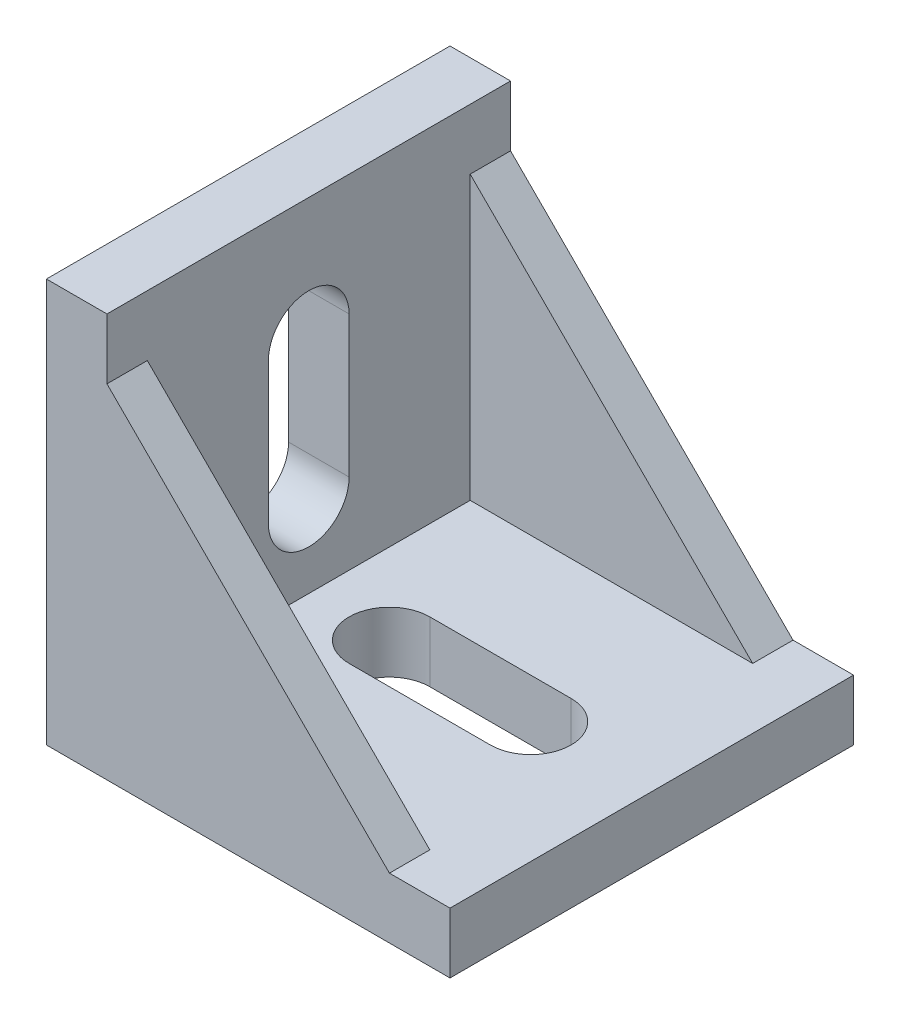
ISO-10303-21;
HEADER;
FILE_DESCRIPTION(('STEP AP214'),'2;1');
FILE_NAME('part.step','',(''),(''),'','','');
FILE_SCHEMA(('AUTOMOTIVE_DESIGN { 1 0 10303 214 1 1 1 1 }'));
ENDSEC;
DATA;
#1=APPLICATION_CONTEXT('core data for automotive mechanical design processes');
#2=APPLICATION_PROTOCOL_DEFINITION('international standard','automotive_design',2000,#1);
#3=PRODUCT_CONTEXT('',#1,'mechanical');
#4=PRODUCT('Part','Part','',(#3));
#5=PRODUCT_RELATED_PRODUCT_CATEGORY('part','',(#4));
#6=PRODUCT_DEFINITION_FORMATION('','',#4);
#7=PRODUCT_DEFINITION_CONTEXT('part definition',#1,'design');
#8=PRODUCT_DEFINITION('design','',#6,#7);
#9=PRODUCT_DEFINITION_SHAPE('','',#8);
#10=(LENGTH_UNIT() NAMED_UNIT(*) SI_UNIT(.MILLI.,.METRE.));
#11=(NAMED_UNIT(*) PLANE_ANGLE_UNIT() SI_UNIT($,.RADIAN.));
#12=(NAMED_UNIT(*) SI_UNIT($,.STERADIAN.) SOLID_ANGLE_UNIT());
#13=UNCERTAINTY_MEASURE_WITH_UNIT(LENGTH_MEASURE(1.E-05),#10,'distance_accuracy_value','');
#14=(GEOMETRIC_REPRESENTATION_CONTEXT(3) GLOBAL_UNCERTAINTY_ASSIGNED_CONTEXT((#13)) GLOBAL_UNIT_ASSIGNED_CONTEXT((#10,
#11,#12)) REPRESENTATION_CONTEXT('',''));
#15=CARTESIAN_POINT('',(0.,0.,0.));
#16=DIRECTION('',(0.,0.,1.));
#17=DIRECTION('',(1.,0.,0.));
#18=AXIS2_PLACEMENT_3D('',#15,#16,#17);
#19=CARTESIAN_POINT('',(7.33979544367892,7.33979544367892,10.));
#20=DIRECTION('',(0.,0.,1.));
#21=DIRECTION('',(1.,0.,0.));
#22=AXIS2_PLACEMENT_3D('',#19,#20,#21);
#23=PLANE('',#22);
#24=DIRECTION('',(0.,-1.,0.));
#25=VECTOR('',#24,1.);
#26=CARTESIAN_POINT('',(0.,0.,10.));
#27=LINE('',#26,#25);
#28=CARTESIAN_POINT('',(0.,20.,10.));
#29=VERTEX_POINT('',#28);
#30=CARTESIAN_POINT('',(0.,0.,10.));
#31=VERTEX_POINT('',#30);
#32=EDGE_CURVE('E10',#29,#31,#27,.T.);
#33=ORIENTED_EDGE('',*,*,#32,.T.);
#34=DIRECTION('',(1.,0.,0.));
#35=VECTOR('',#34,1.);
#36=CARTESIAN_POINT('',(20.,0.,10.));
#37=LINE('',#36,#35);
#38=CARTESIAN_POINT('',(20.,0.,10.));
#39=VERTEX_POINT('',#38);
#40=EDGE_CURVE('E258',#31,#39,#37,.T.);
#41=ORIENTED_EDGE('',*,*,#40,.T.);
#42=DIRECTION('',(0.,1.,0.));
#43=VECTOR('',#42,1.);
#44=CARTESIAN_POINT('',(20.,3.,10.));
#45=LINE('',#44,#43);
#46=CARTESIAN_POINT('',(20.,3.,10.));
#47=VERTEX_POINT('',#46);
#48=EDGE_CURVE('E259',#39,#47,#45,.T.);
#49=ORIENTED_EDGE('',*,*,#48,.T.);
#50=DIRECTION('',(-1.,0.,0.));
#51=VECTOR('',#50,1.);
#52=CARTESIAN_POINT('',(17.,3.,10.));
#53=LINE('',#52,#51);
#54=CARTESIAN_POINT('',(17.,3.,10.));
#55=VERTEX_POINT('',#54);
#56=EDGE_CURVE('E203',#47,#55,#53,.T.);
#57=ORIENTED_EDGE('',*,*,#56,.T.);
#58=DIRECTION('',(-0.707106781186548,0.707106781186548,0.));
#59=VECTOR('',#58,1.);
#60=CARTESIAN_POINT('',(3.,17.,10.));
#61=LINE('',#60,#59);
#62=CARTESIAN_POINT('',(3.,17.,10.));
#63=VERTEX_POINT('',#62);
#64=EDGE_CURVE('E199',#55,#63,#61,.T.);
#65=ORIENTED_EDGE('',*,*,#64,.T.);
#66=DIRECTION('',(0.,1.,0.));
#67=VECTOR('',#66,1.);
#68=CARTESIAN_POINT('',(3.,20.,10.));
#69=LINE('',#68,#67);
#70=CARTESIAN_POINT('',(3.,20.,10.));
#71=VERTEX_POINT('',#70);
#72=EDGE_CURVE('E230',#63,#71,#69,.T.);
#73=ORIENTED_EDGE('',*,*,#72,.T.);
#74=DIRECTION('',(-1.,0.,0.));
#75=VECTOR('',#74,1.);
#76=CARTESIAN_POINT('',(0.,20.,10.));
#77=LINE('',#76,#75);
#78=EDGE_CURVE('E200',#71,#29,#77,.T.);
#79=ORIENTED_EDGE('',*,*,#78,.T.);
#80=EDGE_LOOP('',(#33,#41,#49,#57,#65,#73,#79));
#81=FACE_BOUND('',#80,.T.);
#82=ADVANCED_FACE('F15',(#81),#23,.T.);
#83=CARTESIAN_POINT('',(0.,20.,0.));
#84=DIRECTION('',(-1.,0.,0.));
#85=DIRECTION('',(0.,-1.,0.));
#86=AXIS2_PLACEMENT_3D('',#83,#84,#85);
#87=PLANE('',#86);
#88=DIRECTION('',(0.,0.,1.));
#89=VECTOR('',#88,1.);
#90=CARTESIAN_POINT('',(0.,0.,0.));
#91=LINE('',#90,#89);
#92=CARTESIAN_POINT('',(0.,0.,-10.));
#93=VERTEX_POINT('',#92);
#94=EDGE_CURVE('E26',#93,#31,#91,.T.);
#95=ORIENTED_EDGE('',*,*,#94,.T.);
#96=ORIENTED_EDGE('',*,*,#32,.F.);
#97=DIRECTION('',(0.,0.,-1.));
#98=VECTOR('',#97,1.);
#99=CARTESIAN_POINT('',(0.,20.,0.));
#100=LINE('',#99,#98);
#101=CARTESIAN_POINT('',(0.,20.,-10.));
#102=VERTEX_POINT('',#101);
#103=EDGE_CURVE('E187',#29,#102,#100,.T.);
#104=ORIENTED_EDGE('',*,*,#103,.T.);
#105=DIRECTION('',(0.,1.,0.));
#106=VECTOR('',#105,1.);
#107=CARTESIAN_POINT('',(0.,0.,-10.));
#108=LINE('',#107,#106);
#109=EDGE_CURVE('E206',#93,#102,#108,.T.);
#110=ORIENTED_EDGE('',*,*,#109,.F.);
#111=EDGE_LOOP('',(#95,#96,#104,#110));
#112=FACE_BOUND('',#111,.T.);
#113=CARTESIAN_POINT('',(0.,7.,0.));
#114=DIRECTION('',(1.,0.,0.));
#115=DIRECTION('',(0.,0.,1.));
#116=AXIS2_PLACEMENT_3D('',#113,#114,#115);
#117=CIRCLE('',#116,2.);
#118=CARTESIAN_POINT('',(0.,7.,2.));
#119=VERTEX_POINT('',#118);
#120=CARTESIAN_POINT('',(0.,7.,-2.));
#121=VERTEX_POINT('',#120);
#122=EDGE_CURVE('E245',#119,#121,#117,.T.);
#123=ORIENTED_EDGE('',*,*,#122,.T.);
#124=DIRECTION('',(0.,1.,0.));
#125=VECTOR('',#124,1.);
#126=CARTESIAN_POINT('',(0.,17.,-2.));
#127=LINE('',#126,#125);
#128=CARTESIAN_POINT('',(0.,14.,-2.));
#129=VERTEX_POINT('',#128);
#130=EDGE_CURVE('E74',#121,#129,#127,.T.);
#131=ORIENTED_EDGE('',*,*,#130,.T.);
#132=CARTESIAN_POINT('',(0.,14.,0.));
#133=DIRECTION('',(1.,0.,0.));
#134=DIRECTION('',(0.,0.,-1.));
#135=AXIS2_PLACEMENT_3D('',#132,#133,#134);
#136=CIRCLE('',#135,2.);
#137=CARTESIAN_POINT('',(0.,14.,2.));
#138=VERTEX_POINT('',#137);
#139=EDGE_CURVE('E212',#129,#138,#136,.T.);
#140=ORIENTED_EDGE('',*,*,#139,.T.);
#141=DIRECTION('',(0.,-1.,0.));
#142=VECTOR('',#141,1.);
#143=CARTESIAN_POINT('',(0.,13.5,2.));
#144=LINE('',#143,#142);
#145=EDGE_CURVE('E247',#138,#119,#144,.T.);
#146=ORIENTED_EDGE('',*,*,#145,.T.);
#147=EDGE_LOOP('',(#123,#131,#140,#146));
#148=FACE_BOUND('',#147,.T.);
#149=ADVANCED_FACE('F321',(#112,#148),#87,.T.);
#150=CARTESIAN_POINT('',(0.,0.,0.));
#151=DIRECTION('',(0.,-1.,0.));
#152=DIRECTION('',(1.,0.,0.));
#153=AXIS2_PLACEMENT_3D('',#150,#151,#152);
#154=PLANE('',#153);
#155=DIRECTION('',(0.,0.,-1.));
#156=VECTOR('',#155,1.);
#157=CARTESIAN_POINT('',(20.,0.,0.));
#158=LINE('',#157,#156);
#159=CARTESIAN_POINT('',(20.,0.,-10.));
#160=VERTEX_POINT('',#159);
#161=EDGE_CURVE('E256',#39,#160,#158,.T.);
#162=ORIENTED_EDGE('',*,*,#161,.F.);
#163=ORIENTED_EDGE('',*,*,#40,.F.);
#164=ORIENTED_EDGE('',*,*,#94,.F.);
#165=DIRECTION('',(-1.,0.,0.));
#166=VECTOR('',#165,1.);
#167=CARTESIAN_POINT('',(20.,0.,-10.));
#168=LINE('',#167,#166);
#169=EDGE_CURVE('E302',#160,#93,#168,.T.);
#170=ORIENTED_EDGE('',*,*,#169,.F.);
#171=EDGE_LOOP('',(#162,#163,#164,#170));
#172=FACE_BOUND('',#171,.T.);
#173=CARTESIAN_POINT('',(14.,0.,0.));
#174=DIRECTION('',(0.,1.,0.));
#175=DIRECTION('',(0.,0.,1.));
#176=AXIS2_PLACEMENT_3D('',#173,#174,#175);
#177=CIRCLE('',#176,2.);
#178=CARTESIAN_POINT('',(14.,0.,2.));
#179=VERTEX_POINT('',#178);
#180=CARTESIAN_POINT('',(14.,0.,-2.));
#181=VERTEX_POINT('',#180);
#182=EDGE_CURVE('E220',#179,#181,#177,.T.);
#183=ORIENTED_EDGE('',*,*,#182,.T.);
#184=DIRECTION('',(-1.,0.,0.));
#185=VECTOR('',#184,1.);
#186=CARTESIAN_POINT('',(3.5,0.,-2.));
#187=LINE('',#186,#185);
#188=CARTESIAN_POINT('',(7.,0.,-2.));
#189=VERTEX_POINT('',#188);
#190=EDGE_CURVE('E192',#181,#189,#187,.T.);
#191=ORIENTED_EDGE('',*,*,#190,.T.);
#192=CARTESIAN_POINT('',(7.,0.,0.));
#193=DIRECTION('',(0.,1.,0.));
#194=DIRECTION('',(0.,0.,-1.));
#195=AXIS2_PLACEMENT_3D('',#192,#193,#194);
#196=CIRCLE('',#195,2.);
#197=CARTESIAN_POINT('',(7.,0.,2.));
#198=VERTEX_POINT('',#197);
#199=EDGE_CURVE('E211',#189,#198,#196,.T.);
#200=ORIENTED_EDGE('',*,*,#199,.T.);
#201=DIRECTION('',(1.,0.,0.));
#202=VECTOR('',#201,1.);
#203=CARTESIAN_POINT('',(7.,0.,2.));
#204=LINE('',#203,#202);
#205=EDGE_CURVE('E288',#198,#179,#204,.T.);
#206=ORIENTED_EDGE('',*,*,#205,.T.);
#207=EDGE_LOOP('',(#183,#191,#200,#206));
#208=FACE_BOUND('',#207,.T.);
#209=ADVANCED_FACE('F380',(#172,#208),#154,.T.);
#210=CARTESIAN_POINT('',(20.,0.,0.));
#211=DIRECTION('',(1.,0.,0.));
#212=DIRECTION('',(0.,1.,0.));
#213=AXIS2_PLACEMENT_3D('',#210,#211,#212);
#214=PLANE('',#213);
#215=DIRECTION('',(0.,0.,-1.));
#216=VECTOR('',#215,1.);
#217=CARTESIAN_POINT('',(20.,3.,0.));
#218=LINE('',#217,#216);
#219=CARTESIAN_POINT('',(20.,3.,-10.));
#220=VERTEX_POINT('',#219);
#221=EDGE_CURVE('E158',#47,#220,#218,.T.);
#222=ORIENTED_EDGE('',*,*,#221,.F.);
#223=ORIENTED_EDGE('',*,*,#48,.F.);
#224=ORIENTED_EDGE('',*,*,#161,.T.);
#225=DIRECTION('',(0.,-1.,0.));
#226=VECTOR('',#225,1.);
#227=CARTESIAN_POINT('',(20.,3.,-10.));
#228=LINE('',#227,#226);
#229=EDGE_CURVE('E162',#220,#160,#228,.T.);
#230=ORIENTED_EDGE('',*,*,#229,.F.);
#231=EDGE_LOOP('',(#222,#223,#224,#230));
#232=FACE_BOUND('',#231,.T.);
#233=ADVANCED_FACE('F398',(#232),#214,.T.);
#234=CARTESIAN_POINT('',(20.,3.,0.));
#235=DIRECTION('',(0.,1.,0.));
#236=DIRECTION('',(-1.,0.,0.));
#237=AXIS2_PLACEMENT_3D('',#234,#235,#236);
#238=PLANE('',#237);
#239=DIRECTION('',(0.,0.,-1.));
#240=VECTOR('',#239,1.);
#241=CARTESIAN_POINT('',(17.,3.,0.));
#242=LINE('',#241,#240);
#243=CARTESIAN_POINT('',(17.,3.,8.));
#244=VERTEX_POINT('',#243);
#245=EDGE_CURVE('E219',#55,#244,#242,.T.);
#246=ORIENTED_EDGE('',*,*,#245,.F.);
#247=ORIENTED_EDGE('',*,*,#56,.F.);
#248=ORIENTED_EDGE('',*,*,#221,.T.);
#249=DIRECTION('',(1.,0.,0.));
#250=VECTOR('',#249,1.);
#251=CARTESIAN_POINT('',(17.,3.,-10.));
#252=LINE('',#251,#250);
#253=CARTESIAN_POINT('',(17.,3.,-10.));
#254=VERTEX_POINT('',#253);
#255=EDGE_CURVE('E19',#254,#220,#252,.T.);
#256=ORIENTED_EDGE('',*,*,#255,.F.);
#257=DIRECTION('',(0.,0.,-1.));
#258=VECTOR('',#257,1.);
#259=CARTESIAN_POINT('',(17.,3.,0.));
#260=LINE('',#259,#258);
#261=CARTESIAN_POINT('',(17.,3.,-8.));
#262=VERTEX_POINT('',#261);
#263=EDGE_CURVE('E154',#262,#254,#260,.T.);
#264=ORIENTED_EDGE('',*,*,#263,.F.);
#265=DIRECTION('',(1.,0.,0.));
#266=VECTOR('',#265,1.);
#267=CARTESIAN_POINT('',(6.5,3.,-8.));
#268=LINE('',#267,#266);
#269=CARTESIAN_POINT('',(3.,3.,-8.));
#270=VERTEX_POINT('',#269);
#271=EDGE_CURVE('E177',#270,#262,#268,.T.);
#272=ORIENTED_EDGE('',*,*,#271,.F.);
#273=DIRECTION('',(0.,0.,-1.));
#274=VECTOR('',#273,1.);
#275=CARTESIAN_POINT('',(3.,3.,4.));
#276=LINE('',#275,#274);
#277=CARTESIAN_POINT('',(3.,3.,8.));
#278=VERTEX_POINT('',#277);
#279=EDGE_CURVE('E228',#278,#270,#276,.T.);
#280=ORIENTED_EDGE('',*,*,#279,.F.);
#281=DIRECTION('',(-1.,0.,0.));
#282=VECTOR('',#281,1.);
#283=CARTESIAN_POINT('',(13.5,3.,8.));
#284=LINE('',#283,#282);
#285=EDGE_CURVE('E227',#244,#278,#284,.T.);
#286=ORIENTED_EDGE('',*,*,#285,.F.);
#287=EDGE_LOOP('',(#246,#247,#248,#256,#264,#272,#280,#286));
#288=FACE_BOUND('',#287,.T.);
#289=CARTESIAN_POINT('',(14.,3.,0.));
#290=DIRECTION('',(0.,-1.,0.));
#291=DIRECTION('',(0.,0.,1.));
#292=AXIS2_PLACEMENT_3D('',#289,#290,#291);
#293=CIRCLE('',#292,2.);
#294=CARTESIAN_POINT('',(14.,3.,-2.));
#295=VERTEX_POINT('',#294);
#296=CARTESIAN_POINT('',(14.,3.,2.));
#297=VERTEX_POINT('',#296);
#298=EDGE_CURVE('E193',#295,#297,#293,.T.);
#299=ORIENTED_EDGE('',*,*,#298,.T.);
#300=DIRECTION('',(-1.,0.,0.));
#301=VECTOR('',#300,1.);
#302=CARTESIAN_POINT('',(17.,3.,2.));
#303=LINE('',#302,#301);
#304=CARTESIAN_POINT('',(7.,3.,2.));
#305=VERTEX_POINT('',#304);
#306=EDGE_CURVE('E255',#297,#305,#303,.T.);
#307=ORIENTED_EDGE('',*,*,#306,.T.);
#308=CARTESIAN_POINT('',(7.,3.,0.));
#309=DIRECTION('',(0.,-1.,0.));
#310=DIRECTION('',(0.,0.,-1.));
#311=AXIS2_PLACEMENT_3D('',#308,#309,#310);
#312=CIRCLE('',#311,2.);
#313=CARTESIAN_POINT('',(7.,3.,-2.));
#314=VERTEX_POINT('',#313);
#315=EDGE_CURVE('E236',#305,#314,#312,.T.);
#316=ORIENTED_EDGE('',*,*,#315,.T.);
#317=DIRECTION('',(1.,0.,0.));
#318=VECTOR('',#317,1.);
#319=CARTESIAN_POINT('',(13.5,3.,-2.));
#320=LINE('',#319,#318);
#321=EDGE_CURVE('E293',#314,#295,#320,.T.);
#322=ORIENTED_EDGE('',*,*,#321,.T.);
#323=EDGE_LOOP('',(#299,#307,#316,#322));
#324=FACE_BOUND('',#323,.T.);
#325=ADVANCED_FACE('F150',(#288,#324),#238,.T.);
#326=CARTESIAN_POINT('',(3.,20.,0.));
#327=DIRECTION('',(0.,1.,0.));
#328=DIRECTION('',(-1.,0.,0.));
#329=AXIS2_PLACEMENT_3D('',#326,#327,#328);
#330=PLANE('',#329);
#331=ORIENTED_EDGE('',*,*,#103,.F.);
#332=ORIENTED_EDGE('',*,*,#78,.F.);
#333=DIRECTION('',(0.,0.,-1.));
#334=VECTOR('',#333,1.);
#335=CARTESIAN_POINT('',(3.,20.,0.));
#336=LINE('',#335,#334);
#337=CARTESIAN_POINT('',(3.,20.,-10.));
#338=VERTEX_POINT('',#337);
#339=EDGE_CURVE('E233',#71,#338,#336,.T.);
#340=ORIENTED_EDGE('',*,*,#339,.T.);
#341=DIRECTION('',(1.,0.,0.));
#342=VECTOR('',#341,1.);
#343=CARTESIAN_POINT('',(0.,20.,-10.));
#344=LINE('',#343,#342);
#345=EDGE_CURVE('E163',#102,#338,#344,.T.);
#346=ORIENTED_EDGE('',*,*,#345,.F.);
#347=EDGE_LOOP('',(#331,#332,#340,#346));
#348=FACE_BOUND('',#347,.T.);
#349=ADVANCED_FACE('F326',(#348),#330,.T.);
#350=CARTESIAN_POINT('',(7.33979544367892,7.33979544367892,-10.));
#351=DIRECTION('',(0.,0.,-1.));
#352=DIRECTION('',(-1.,0.,0.));
#353=AXIS2_PLACEMENT_3D('',#350,#351,#352);
#354=PLANE('',#353);
#355=ORIENTED_EDGE('',*,*,#109,.T.);
#356=ORIENTED_EDGE('',*,*,#345,.T.);
#357=DIRECTION('',(0.,-1.,0.));
#358=VECTOR('',#357,1.);
#359=CARTESIAN_POINT('',(3.,20.,-10.));
#360=LINE('',#359,#358);
#361=CARTESIAN_POINT('',(3.,17.,-10.));
#362=VERTEX_POINT('',#361);
#363=EDGE_CURVE('E144',#338,#362,#360,.T.);
#364=ORIENTED_EDGE('',*,*,#363,.T.);
#365=DIRECTION('',(0.707106781186548,-0.707106781186548,0.));
#366=VECTOR('',#365,1.);
#367=CARTESIAN_POINT('',(3.,17.,-10.));
#368=LINE('',#367,#366);
#369=EDGE_CURVE('E165',#362,#254,#368,.T.);
#370=ORIENTED_EDGE('',*,*,#369,.T.);
#371=ORIENTED_EDGE('',*,*,#255,.T.);
#372=ORIENTED_EDGE('',*,*,#229,.T.);
#373=ORIENTED_EDGE('',*,*,#169,.T.);
#374=EDGE_LOOP('',(#355,#356,#364,#370,#371,#372,#373));
#375=FACE_BOUND('',#374,.T.);
#376=ADVANCED_FACE('F167',(#375),#354,.T.);
#377=CARTESIAN_POINT('',(3.,17.,0.));
#378=DIRECTION('',(1.,0.,0.));
#379=DIRECTION('',(0.,1.,0.));
#380=AXIS2_PLACEMENT_3D('',#377,#378,#379);
#381=PLANE('',#380);
#382=ORIENTED_EDGE('',*,*,#339,.F.);
#383=ORIENTED_EDGE('',*,*,#72,.F.);
#384=DIRECTION('',(0.,0.,-1.));
#385=VECTOR('',#384,1.);
#386=CARTESIAN_POINT('',(3.,17.,0.));
#387=LINE('',#386,#385);
#388=CARTESIAN_POINT('',(3.,17.,8.));
#389=VERTEX_POINT('',#388);
#390=EDGE_CURVE('E196',#63,#389,#387,.T.);
#391=ORIENTED_EDGE('',*,*,#390,.T.);
#392=DIRECTION('',(0.,-1.,0.));
#393=VECTOR('',#392,1.);
#394=CARTESIAN_POINT('',(3.,20.,8.));
#395=LINE('',#394,#393);
#396=EDGE_CURVE('E208',#389,#278,#395,.T.);
#397=ORIENTED_EDGE('',*,*,#396,.T.);
#398=ORIENTED_EDGE('',*,*,#279,.T.);
#399=DIRECTION('',(0.,-1.,0.));
#400=VECTOR('',#399,1.);
#401=CARTESIAN_POINT('',(3.,20.,-8.));
#402=LINE('',#401,#400);
#403=CARTESIAN_POINT('',(3.,17.,-8.));
#404=VERTEX_POINT('',#403);
#405=EDGE_CURVE('E183',#404,#270,#402,.T.);
#406=ORIENTED_EDGE('',*,*,#405,.F.);
#407=DIRECTION('',(0.,0.,-1.));
#408=VECTOR('',#407,1.);
#409=CARTESIAN_POINT('',(3.,17.,0.));
#410=LINE('',#409,#408);
#411=EDGE_CURVE('E170',#404,#362,#410,.T.);
#412=ORIENTED_EDGE('',*,*,#411,.T.);
#413=ORIENTED_EDGE('',*,*,#363,.F.);
#414=EDGE_LOOP('',(#382,#383,#391,#397,#398,#406,#412,#413));
#415=FACE_BOUND('',#414,.T.);
#416=CARTESIAN_POINT('',(3.,7.,0.));
#417=DIRECTION('',(-1.,0.,0.));
#418=DIRECTION('',(0.,0.,1.));
#419=AXIS2_PLACEMENT_3D('',#416,#417,#418);
#420=CIRCLE('',#419,2.);
#421=CARTESIAN_POINT('',(3.,7.,-2.));
#422=VERTEX_POINT('',#421);
#423=CARTESIAN_POINT('',(3.,7.,2.));
#424=VERTEX_POINT('',#423);
#425=EDGE_CURVE('E83',#422,#424,#420,.T.);
#426=ORIENTED_EDGE('',*,*,#425,.T.);
#427=DIRECTION('',(0.,1.,0.));
#428=VECTOR('',#427,1.);
#429=CARTESIAN_POINT('',(3.,12.,2.));
#430=LINE('',#429,#428);
#431=CARTESIAN_POINT('',(3.,14.,2.));
#432=VERTEX_POINT('',#431);
#433=EDGE_CURVE('E246',#424,#432,#430,.T.);
#434=ORIENTED_EDGE('',*,*,#433,.T.);
#435=CARTESIAN_POINT('',(3.,14.,0.));
#436=DIRECTION('',(-1.,0.,0.));
#437=DIRECTION('',(0.,0.,-1.));
#438=AXIS2_PLACEMENT_3D('',#435,#436,#437);
#439=CIRCLE('',#438,2.);
#440=CARTESIAN_POINT('',(3.,14.,-2.));
#441=VERTEX_POINT('',#440);
#442=EDGE_CURVE('E281',#432,#441,#439,.T.);
#443=ORIENTED_EDGE('',*,*,#442,.T.);
#444=DIRECTION('',(0.,-1.,0.));
#445=VECTOR('',#444,1.);
#446=CARTESIAN_POINT('',(3.,15.5,-2.));
#447=LINE('',#446,#445);
#448=EDGE_CURVE('E209',#441,#422,#447,.T.);
#449=ORIENTED_EDGE('',*,*,#448,.T.);
#450=EDGE_LOOP('',(#426,#434,#443,#449));
#451=FACE_BOUND('',#450,.T.);
#452=ADVANCED_FACE('F330',(#415,#451),#381,.T.);
#453=CARTESIAN_POINT('',(17.,3.,0.));
#454=DIRECTION('',(0.707106781186548,0.707106781186548,0.));
#455=DIRECTION('',(-0.707106781186548,0.707106781186548,0.));
#456=AXIS2_PLACEMENT_3D('',#453,#454,#455);
#457=PLANE('',#456);
#458=DIRECTION('',(-0.707106781186548,0.707106781186548,0.));
#459=VECTOR('',#458,1.);
#460=CARTESIAN_POINT('',(12.75,7.25,8.));
#461=LINE('',#460,#459);
#462=EDGE_CURVE('E290',#244,#389,#461,.T.);
#463=ORIENTED_EDGE('',*,*,#462,.T.);
#464=ORIENTED_EDGE('',*,*,#390,.F.);
#465=ORIENTED_EDGE('',*,*,#64,.F.);
#466=ORIENTED_EDGE('',*,*,#245,.T.);
#467=EDGE_LOOP('',(#463,#464,#465,#466));
#468=FACE_BOUND('',#467,.T.);
#469=ADVANCED_FACE('F344',(#468),#457,.T.);
#470=CARTESIAN_POINT('',(17.,3.,0.));
#471=DIRECTION('',(0.707106781186548,0.707106781186548,0.));
#472=DIRECTION('',(-0.707106781186548,0.707106781186548,0.));
#473=AXIS2_PLACEMENT_3D('',#470,#471,#472);
#474=PLANE('',#473);
#475=DIRECTION('',(0.707106781186548,-0.707106781186548,0.));
#476=VECTOR('',#475,1.);
#477=CARTESIAN_POINT('',(9.25,10.75,-8.));
#478=LINE('',#477,#476);
#479=EDGE_CURVE('E175',#404,#262,#478,.T.);
#480=ORIENTED_EDGE('',*,*,#479,.T.);
#481=ORIENTED_EDGE('',*,*,#263,.T.);
#482=ORIENTED_EDGE('',*,*,#369,.F.);
#483=ORIENTED_EDGE('',*,*,#411,.F.);
#484=EDGE_LOOP('',(#480,#481,#482,#483));
#485=FACE_BOUND('',#484,.T.);
#486=ADVANCED_FACE('F173',(#485),#474,.T.);
#487=CARTESIAN_POINT('',(3.,20.,-8.));
#488=DIRECTION('',(0.,0.,-1.));
#489=DIRECTION('',(1.,0.,0.));
#490=AXIS2_PLACEMENT_3D('',#487,#488,#489);
#491=PLANE('',#490);
#492=ORIENTED_EDGE('',*,*,#479,.F.);
#493=ORIENTED_EDGE('',*,*,#405,.T.);
#494=ORIENTED_EDGE('',*,*,#271,.T.);
#495=EDGE_LOOP('',(#492,#493,#494));
#496=FACE_BOUND('',#495,.T.);
#497=ADVANCED_FACE('F336',(#496),#491,.F.);
#498=CARTESIAN_POINT('',(17.,20.,8.));
#499=DIRECTION('',(0.,0.,1.));
#500=DIRECTION('',(-1.,0.,0.));
#501=AXIS2_PLACEMENT_3D('',#498,#499,#500);
#502=PLANE('',#501);
#503=ORIENTED_EDGE('',*,*,#462,.F.);
#504=ORIENTED_EDGE('',*,*,#285,.T.);
#505=ORIENTED_EDGE('',*,*,#396,.F.);
#506=EDGE_LOOP('',(#503,#504,#505));
#507=FACE_BOUND('',#506,.T.);
#508=ADVANCED_FACE('F342',(#507),#502,.F.);
#509=CARTESIAN_POINT('',(7.,3.,-2.));
#510=DIRECTION('',(0.,0.,-1.));
#511=DIRECTION('',(1.,0.,0.));
#512=AXIS2_PLACEMENT_3D('',#509,#510,#511);
#513=PLANE('',#512);
#514=ORIENTED_EDGE('',*,*,#190,.F.);
#515=DIRECTION('',(0.,-1.,0.));
#516=VECTOR('',#515,1.);
#517=CARTESIAN_POINT('',(14.,3.,-2.));
#518=LINE('',#517,#516);
#519=EDGE_CURVE('E189',#295,#181,#518,.T.);
#520=ORIENTED_EDGE('',*,*,#519,.F.);
#521=ORIENTED_EDGE('',*,*,#321,.F.);
#522=DIRECTION('',(0.,-1.,0.));
#523=VECTOR('',#522,1.);
#524=CARTESIAN_POINT('',(7.,3.,-2.));
#525=LINE('',#524,#523);
#526=EDGE_CURVE('E240',#314,#189,#525,.T.);
#527=ORIENTED_EDGE('',*,*,#526,.T.);
#528=EDGE_LOOP('',(#514,#520,#521,#527));
#529=FACE_BOUND('',#528,.T.);
#530=ADVANCED_FACE('F382',(#529),#513,.F.);
#531=CARTESIAN_POINT('',(14.,3.,0.));
#532=DIRECTION('',(0.,1.,0.));
#533=DIRECTION('',(0.,0.,1.));
#534=AXIS2_PLACEMENT_3D('',#531,#532,#533);
#535=CYLINDRICAL_SURFACE('',#534,2.);
#536=ORIENTED_EDGE('',*,*,#182,.F.);
#537=DIRECTION('',(0.,-1.,0.));
#538=VECTOR('',#537,1.);
#539=CARTESIAN_POINT('',(14.,3.,2.));
#540=LINE('',#539,#538);
#541=EDGE_CURVE('E223',#297,#179,#540,.T.);
#542=ORIENTED_EDGE('',*,*,#541,.F.);
#543=ORIENTED_EDGE('',*,*,#298,.F.);
#544=ORIENTED_EDGE('',*,*,#519,.T.);
#545=EDGE_LOOP('',(#536,#542,#543,#544));
#546=FACE_BOUND('',#545,.T.);
#547=ADVANCED_FACE('F384',(#546),#535,.F.);
#548=CARTESIAN_POINT('',(14.,3.,2.));
#549=DIRECTION('',(0.,0.,1.));
#550=DIRECTION('',(-1.,0.,0.));
#551=AXIS2_PLACEMENT_3D('',#548,#549,#550);
#552=PLANE('',#551);
#553=ORIENTED_EDGE('',*,*,#205,.F.);
#554=DIRECTION('',(0.,-1.,0.));
#555=VECTOR('',#554,1.);
#556=CARTESIAN_POINT('',(7.,3.,2.));
#557=LINE('',#556,#555);
#558=EDGE_CURVE('E239',#305,#198,#557,.T.);
#559=ORIENTED_EDGE('',*,*,#558,.F.);
#560=ORIENTED_EDGE('',*,*,#306,.F.);
#561=ORIENTED_EDGE('',*,*,#541,.T.);
#562=EDGE_LOOP('',(#553,#559,#560,#561));
#563=FACE_BOUND('',#562,.T.);
#564=ADVANCED_FACE('F372',(#563),#552,.F.);
#565=CARTESIAN_POINT('',(7.,3.,0.));
#566=DIRECTION('',(0.,1.,0.));
#567=DIRECTION('',(0.,0.,-1.));
#568=AXIS2_PLACEMENT_3D('',#565,#566,#567);
#569=CYLINDRICAL_SURFACE('',#568,2.);
#570=ORIENTED_EDGE('',*,*,#199,.F.);
#571=ORIENTED_EDGE('',*,*,#526,.F.);
#572=ORIENTED_EDGE('',*,*,#315,.F.);
#573=ORIENTED_EDGE('',*,*,#558,.T.);
#574=EDGE_LOOP('',(#570,#571,#572,#573));
#575=FACE_BOUND('',#574,.T.);
#576=ADVANCED_FACE('F364',(#575),#569,.F.);
#577=CARTESIAN_POINT('',(3.,14.,-2.));
#578=DIRECTION('',(0.,0.,-1.));
#579=DIRECTION('',(0.,-1.,0.));
#580=AXIS2_PLACEMENT_3D('',#577,#578,#579);
#581=PLANE('',#580);
#582=ORIENTED_EDGE('',*,*,#130,.F.);
#583=DIRECTION('',(-1.,0.,0.));
#584=VECTOR('',#583,1.);
#585=CARTESIAN_POINT('',(3.,7.,-2.));
#586=LINE('',#585,#584);
#587=EDGE_CURVE('E286',#422,#121,#586,.T.);
#588=ORIENTED_EDGE('',*,*,#587,.F.);
#589=ORIENTED_EDGE('',*,*,#448,.F.);
#590=DIRECTION('',(-1.,0.,0.));
#591=VECTOR('',#590,1.);
#592=CARTESIAN_POINT('',(3.,14.,-2.));
#593=LINE('',#592,#591);
#594=EDGE_CURVE('E215',#441,#129,#593,.T.);
#595=ORIENTED_EDGE('',*,*,#594,.T.);
#596=EDGE_LOOP('',(#582,#588,#589,#595));
#597=FACE_BOUND('',#596,.T.);
#598=ADVANCED_FACE('F362',(#597),#581,.F.);
#599=CARTESIAN_POINT('',(3.,7.,0.));
#600=DIRECTION('',(1.,0.,0.));
#601=DIRECTION('',(0.,0.,1.));
#602=AXIS2_PLACEMENT_3D('',#599,#600,#601);
#603=CYLINDRICAL_SURFACE('',#602,2.);
#604=ORIENTED_EDGE('',*,*,#122,.F.);
#605=DIRECTION('',(-1.,0.,0.));
#606=VECTOR('',#605,1.);
#607=CARTESIAN_POINT('',(3.,7.,2.));
#608=LINE('',#607,#606);
#609=EDGE_CURVE('E241',#424,#119,#608,.T.);
#610=ORIENTED_EDGE('',*,*,#609,.F.);
#611=ORIENTED_EDGE('',*,*,#425,.F.);
#612=ORIENTED_EDGE('',*,*,#587,.T.);
#613=EDGE_LOOP('',(#604,#610,#611,#612));
#614=FACE_BOUND('',#613,.T.);
#615=ADVANCED_FACE('F352',(#614),#603,.F.);
#616=CARTESIAN_POINT('',(3.,7.,2.));
#617=DIRECTION('',(0.,0.,1.));
#618=DIRECTION('',(0.,1.,0.));
#619=AXIS2_PLACEMENT_3D('',#616,#617,#618);
#620=PLANE('',#619);
#621=ORIENTED_EDGE('',*,*,#145,.F.);
#622=DIRECTION('',(-1.,0.,0.));
#623=VECTOR('',#622,1.);
#624=CARTESIAN_POINT('',(3.,14.,2.));
#625=LINE('',#624,#623);
#626=EDGE_CURVE('E250',#432,#138,#625,.T.);
#627=ORIENTED_EDGE('',*,*,#626,.F.);
#628=ORIENTED_EDGE('',*,*,#433,.F.);
#629=ORIENTED_EDGE('',*,*,#609,.T.);
#630=EDGE_LOOP('',(#621,#627,#628,#629));
#631=FACE_BOUND('',#630,.T.);
#632=ADVANCED_FACE('F17',(#631),#620,.F.);
#633=CARTESIAN_POINT('',(3.,14.,0.));
#634=DIRECTION('',(1.,0.,0.));
#635=DIRECTION('',(0.,0.,-1.));
#636=AXIS2_PLACEMENT_3D('',#633,#634,#635);
#637=CYLINDRICAL_SURFACE('',#636,2.);
#638=ORIENTED_EDGE('',*,*,#139,.F.);
#639=ORIENTED_EDGE('',*,*,#594,.F.);
#640=ORIENTED_EDGE('',*,*,#442,.F.);
#641=ORIENTED_EDGE('',*,*,#626,.T.);
#642=EDGE_LOOP('',(#638,#639,#640,#641));
#643=FACE_BOUND('',#642,.T.);
#644=ADVANCED_FACE('F361',(#643),#637,.F.);
#645=CLOSED_SHELL('',(#82,#149,#209,#233,#325,#349,#376,#452,#469,#486,#497,#508,#530,#547,#564,
#576,#598,#615,#632,#644));
#646=MANIFOLD_SOLID_BREP('B1',#645);
#647=ADVANCED_BREP_SHAPE_REPRESENTATION('',(#18,#646),#14);
#648=SHAPE_DEFINITION_REPRESENTATION(#9,#647);
ENDSEC;
END-ISO-10303-21;
